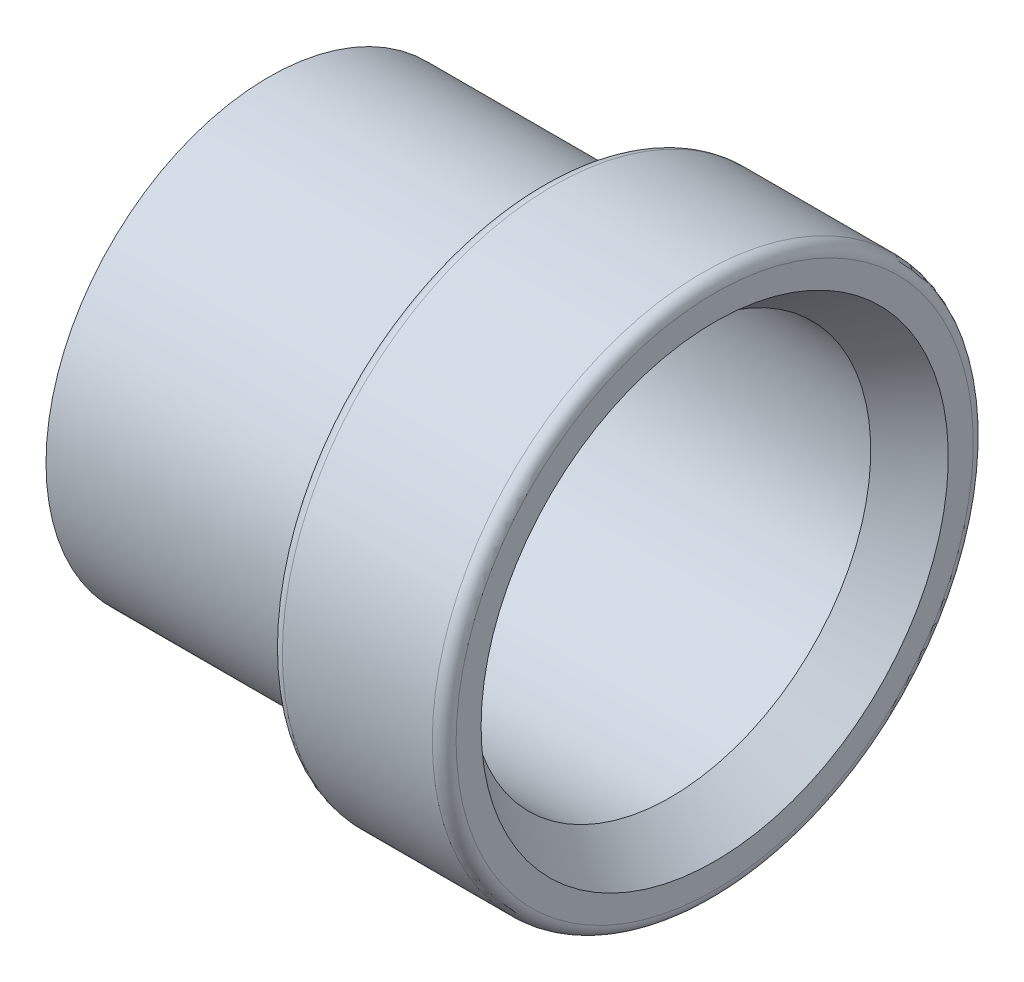
ISO-10303-21;
HEADER;
FILE_DESCRIPTION(('STEP AP214'),'2;1');
FILE_NAME('part.step','',(''),(''),'','','');
FILE_SCHEMA(('AUTOMOTIVE_DESIGN { 1 0 10303 214 1 1 1 1 }'));
ENDSEC;
DATA;
#1=APPLICATION_CONTEXT('core data for automotive mechanical design processes');
#2=APPLICATION_PROTOCOL_DEFINITION('international standard','automotive_design',2000,#1);
#3=PRODUCT_CONTEXT('',#1,'mechanical');
#4=PRODUCT('Part','Part','',(#3));
#5=PRODUCT_RELATED_PRODUCT_CATEGORY('part','',(#4));
#6=PRODUCT_DEFINITION_FORMATION('','',#4);
#7=PRODUCT_DEFINITION_CONTEXT('part definition',#1,'design');
#8=PRODUCT_DEFINITION('design','',#6,#7);
#9=PRODUCT_DEFINITION_SHAPE('','',#8);
#10=(LENGTH_UNIT() NAMED_UNIT(*) SI_UNIT(.MILLI.,.METRE.));
#11=(NAMED_UNIT(*) PLANE_ANGLE_UNIT() SI_UNIT($,.RADIAN.));
#12=(NAMED_UNIT(*) SI_UNIT($,.STERADIAN.) SOLID_ANGLE_UNIT());
#13=UNCERTAINTY_MEASURE_WITH_UNIT(LENGTH_MEASURE(1.E-05),#10,'distance_accuracy_value','');
#14=(GEOMETRIC_REPRESENTATION_CONTEXT(3) GLOBAL_UNCERTAINTY_ASSIGNED_CONTEXT((#13)) GLOBAL_UNIT_ASSIGNED_CONTEXT((#10,
#11,#12)) REPRESENTATION_CONTEXT('',''));
#15=CARTESIAN_POINT('',(0.,0.,0.));
#16=DIRECTION('',(0.,0.,1.));
#17=DIRECTION('',(1.,0.,0.));
#18=AXIS2_PLACEMENT_3D('',#15,#16,#17);
#19=CARTESIAN_POINT('',(-7.1374,6.4135,0.));
#20=DIRECTION('',(1.,0.,0.));
#21=DIRECTION('',(0.,0.,-1.));
#22=AXIS2_PLACEMENT_3D('',#19,#20,#21);
#23=PLANE('',#22);
#24=CARTESIAN_POINT('',(-7.1374,0.,0.));
#25=DIRECTION('',(-1.,0.,0.));
#26=DIRECTION('',(0.,0.,1.));
#27=AXIS2_PLACEMENT_3D('',#24,#25,#26);
#28=CIRCLE('',#27,6.4135);
#29=CARTESIAN_POINT('',(-7.1374,0.,6.4135));
#30=VERTEX_POINT('',#29);
#31=EDGE_CURVE('E10',#30,#30,#28,.T.);
#32=ORIENTED_EDGE('',*,*,#31,.F.);
#33=EDGE_LOOP('',(#32));
#34=FACE_BOUND('',#33,.T.);
#35=CARTESIAN_POINT('',(-7.1374,0.,0.));
#36=DIRECTION('',(-1.,0.,0.));
#37=DIRECTION('',(0.,0.,1.));
#38=AXIS2_PLACEMENT_3D('',#35,#36,#37);
#39=CIRCLE('',#38,7.1374);
#40=CARTESIAN_POINT('',(-7.1374,0.,7.1374));
#41=VERTEX_POINT('',#40);
#42=EDGE_CURVE('E60',#41,#41,#39,.T.);
#43=ORIENTED_EDGE('',*,*,#42,.T.);
#44=EDGE_LOOP('',(#43));
#45=FACE_BOUND('',#44,.T.);
#46=ADVANCED_FACE('F29',(#34,#45),#23,.F.);
#47=CARTESIAN_POINT('',(-7.1374,0.,0.));
#48=DIRECTION('',(-1.,0.,0.));
#49=DIRECTION('',(0.,0.,1.));
#50=AXIS2_PLACEMENT_3D('',#47,#48,#49);
#51=CYLINDRICAL_SURFACE('',#50,6.4135);
#52=CARTESIAN_POINT('',(5.72170858429535,0.,0.));
#53=DIRECTION('',(-1.,0.,0.));
#54=DIRECTION('',(0.,0.,1.));
#55=AXIS2_PLACEMENT_3D('',#52,#53,#54);
#56=CIRCLE('',#55,6.4135);
#57=CARTESIAN_POINT('',(5.72170858429535,0.,6.4135));
#58=VERTEX_POINT('',#57);
#59=EDGE_CURVE('E35',#58,#58,#56,.T.);
#60=ORIENTED_EDGE('',*,*,#59,.F.);
#61=EDGE_LOOP('',(#60));
#62=FACE_BOUND('',#61,.T.);
#63=ORIENTED_EDGE('',*,*,#31,.T.);
#64=EDGE_LOOP('',(#63));
#65=FACE_BOUND('',#64,.T.);
#66=ADVANCED_FACE('F103',(#62,#65),#51,.F.);
#67=CARTESIAN_POINT('',(5.72170858429535,0.,0.));
#68=DIRECTION('',(1.,0.,0.));
#69=DIRECTION('',(0.,0.,-1.));
#70=AXIS2_PLACEMENT_3D('',#67,#68,#69);
#71=CONICAL_SURFACE('',#70,6.4135,0.645771823237904);
#72=CARTESIAN_POINT('',(7.1374,0.,0.));
#73=DIRECTION('',(-1.,0.,0.));
#74=DIRECTION('',(0.,0.,1.));
#75=AXIS2_PLACEMENT_3D('',#72,#73,#74);
#76=CIRCLE('',#75,7.4803);
#77=CARTESIAN_POINT('',(7.1374,0.,7.4803));
#78=VERTEX_POINT('',#77);
#79=EDGE_CURVE('E39',#78,#78,#76,.T.);
#80=ORIENTED_EDGE('',*,*,#79,.F.);
#81=EDGE_LOOP('',(#80));
#82=FACE_BOUND('',#81,.T.);
#83=ORIENTED_EDGE('',*,*,#59,.T.);
#84=EDGE_LOOP('',(#83));
#85=FACE_BOUND('',#84,.T.);
#86=ADVANCED_FACE('F98',(#82,#85),#71,.F.);
#87=CARTESIAN_POINT('',(7.1374,7.4803,0.));
#88=DIRECTION('',(-1.,0.,0.));
#89=DIRECTION('',(0.,0.,1.));
#90=AXIS2_PLACEMENT_3D('',#87,#88,#89);
#91=PLANE('',#90);
#92=CARTESIAN_POINT('',(7.1374,0.,0.));
#93=DIRECTION('',(-1.,0.,0.));
#94=DIRECTION('',(0.,0.,1.));
#95=AXIS2_PLACEMENT_3D('',#92,#93,#94);
#96=CIRCLE('',#95,8.2804);
#97=CARTESIAN_POINT('',(7.1374,0.,8.2804));
#98=VERTEX_POINT('',#97);
#99=EDGE_CURVE('E43',#98,#98,#96,.T.);
#100=ORIENTED_EDGE('',*,*,#99,.F.);
#101=EDGE_LOOP('',(#100));
#102=FACE_BOUND('',#101,.T.);
#103=ORIENTED_EDGE('',*,*,#79,.T.);
#104=EDGE_LOOP('',(#103));
#105=FACE_BOUND('',#104,.T.);
#106=ADVANCED_FACE('F92',(#102,#105),#91,.F.);
#107=CARTESIAN_POINT('',(6.7564,0.,0.));
#108=DIRECTION('',(-1.,0.,0.));
#109=DIRECTION('',(0.,0.,1.));
#110=AXIS2_PLACEMENT_3D('',#107,#108,#109);
#111=TOROIDAL_SURFACE('',#110,8.2804,0.381);
#112=CARTESIAN_POINT('',(6.7564,0.,0.));
#113=DIRECTION('',(-1.,0.,0.));
#114=DIRECTION('',(0.,0.,1.));
#115=AXIS2_PLACEMENT_3D('',#112,#113,#114);
#116=CIRCLE('',#115,8.6614);
#117=CARTESIAN_POINT('',(6.7564,0.,8.6614));
#118=VERTEX_POINT('',#117);
#119=EDGE_CURVE('E48',#118,#118,#116,.T.);
#120=ORIENTED_EDGE('',*,*,#119,.F.);
#121=EDGE_LOOP('',(#120));
#122=FACE_BOUND('',#121,.T.);
#123=ORIENTED_EDGE('',*,*,#99,.T.);
#124=EDGE_LOOP('',(#123));
#125=FACE_BOUND('',#124,.T.);
#126=ADVANCED_FACE('F86',(#122,#125),#111,.T.);
#127=CARTESIAN_POINT('',(-7.1374,0.,0.));
#128=DIRECTION('',(-1.,0.,0.));
#129=DIRECTION('',(0.,0.,1.));
#130=AXIS2_PLACEMENT_3D('',#127,#128,#129);
#131=CYLINDRICAL_SURFACE('',#130,8.6614);
#132=CARTESIAN_POINT('',(1.9558,0.,0.));
#133=DIRECTION('',(-1.,0.,0.));
#134=DIRECTION('',(0.,0.,1.));
#135=AXIS2_PLACEMENT_3D('',#132,#133,#134);
#136=CIRCLE('',#135,8.6614);
#137=CARTESIAN_POINT('',(1.9558,0.,8.6614));
#138=VERTEX_POINT('',#137);
#139=EDGE_CURVE('E51',#138,#138,#136,.T.);
#140=ORIENTED_EDGE('',*,*,#139,.F.);
#141=EDGE_LOOP('',(#140));
#142=FACE_BOUND('',#141,.T.);
#143=ORIENTED_EDGE('',*,*,#119,.T.);
#144=EDGE_LOOP('',(#143));
#145=FACE_BOUND('',#144,.T.);
#146=ADVANCED_FACE('F80',(#142,#145),#131,.T.);
#147=CARTESIAN_POINT('',(1.9558,0.,0.));
#148=DIRECTION('',(-1.,0.,0.));
#149=DIRECTION('',(0.,0.,1.));
#150=AXIS2_PLACEMENT_3D('',#147,#148,#149);
#151=TOROIDAL_SURFACE('',#150,8.2804,0.381);
#152=CARTESIAN_POINT('',(1.5748,0.,0.));
#153=DIRECTION('',(-1.,0.,0.));
#154=DIRECTION('',(0.,0.,1.));
#155=AXIS2_PLACEMENT_3D('',#152,#153,#154);
#156=CIRCLE('',#155,8.2804);
#157=CARTESIAN_POINT('',(1.5748,0.,8.2804));
#158=VERTEX_POINT('',#157);
#159=EDGE_CURVE('E54',#158,#158,#156,.T.);
#160=ORIENTED_EDGE('',*,*,#159,.F.);
#161=EDGE_LOOP('',(#160));
#162=FACE_BOUND('',#161,.T.);
#163=ORIENTED_EDGE('',*,*,#139,.T.);
#164=EDGE_LOOP('',(#163));
#165=FACE_BOUND('',#164,.T.);
#166=ADVANCED_FACE('F74',(#162,#165),#151,.T.);
#167=CARTESIAN_POINT('',(1.5748,8.2804,0.));
#168=DIRECTION('',(1.,0.,0.));
#169=DIRECTION('',(0.,0.,-1.));
#170=AXIS2_PLACEMENT_3D('',#167,#168,#169);
#171=PLANE('',#170);
#172=CARTESIAN_POINT('',(1.5748,0.,0.));
#173=DIRECTION('',(-1.,0.,0.));
#174=DIRECTION('',(0.,0.,1.));
#175=AXIS2_PLACEMENT_3D('',#172,#173,#174);
#176=CIRCLE('',#175,7.1374);
#177=CARTESIAN_POINT('',(1.5748,0.,7.1374));
#178=VERTEX_POINT('',#177);
#179=EDGE_CURVE('E57',#178,#178,#176,.T.);
#180=ORIENTED_EDGE('',*,*,#179,.F.);
#181=EDGE_LOOP('',(#180));
#182=FACE_BOUND('',#181,.T.);
#183=ORIENTED_EDGE('',*,*,#159,.T.);
#184=EDGE_LOOP('',(#183));
#185=FACE_BOUND('',#184,.T.);
#186=ADVANCED_FACE('F68',(#182,#185),#171,.F.);
#187=CARTESIAN_POINT('',(-7.1374,0.,0.));
#188=DIRECTION('',(-1.,0.,0.));
#189=DIRECTION('',(0.,0.,1.));
#190=AXIS2_PLACEMENT_3D('',#187,#188,#189);
#191=CYLINDRICAL_SURFACE('',#190,7.1374);
#192=ORIENTED_EDGE('',*,*,#42,.F.);
#193=EDGE_LOOP('',(#192));
#194=FACE_BOUND('',#193,.T.);
#195=ORIENTED_EDGE('',*,*,#179,.T.);
#196=EDGE_LOOP('',(#195));
#197=FACE_BOUND('',#196,.T.);
#198=ADVANCED_FACE('F65',(#194,#197),#191,.T.);
#199=CLOSED_SHELL('',(#46,#66,#86,#106,#126,#146,#166,#186,#198));
#200=MANIFOLD_SOLID_BREP('B2',#199);
#201=ADVANCED_BREP_SHAPE_REPRESENTATION('',(#18,#200),#14);
#202=SHAPE_DEFINITION_REPRESENTATION(#9,#201);
ENDSEC;
END-ISO-10303-21;
